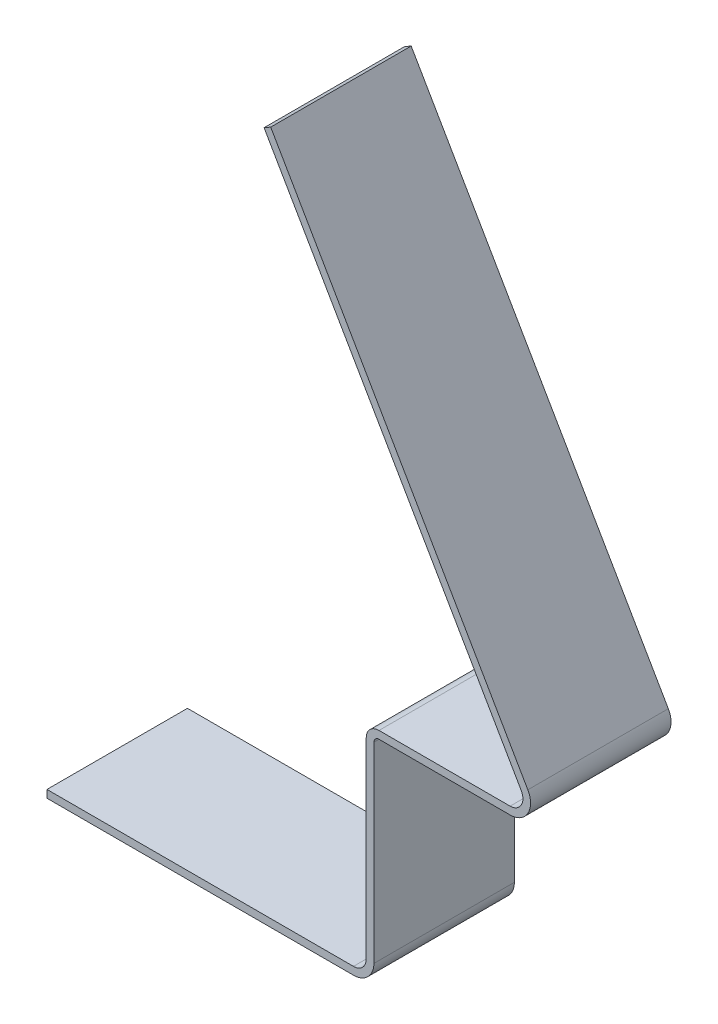
ISO-10303-21;
HEADER;
FILE_DESCRIPTION(('STEP AP214'),'2;1');
FILE_NAME('part.step','',(''),(''),'','','');
FILE_SCHEMA(('AUTOMOTIVE_DESIGN { 1 0 10303 214 1 1 1 1 }'));
ENDSEC;
DATA;
#1=APPLICATION_CONTEXT('core data for automotive mechanical design processes');
#2=APPLICATION_PROTOCOL_DEFINITION('international standard','automotive_design',2000,#1);
#3=PRODUCT_CONTEXT('',#1,'mechanical');
#4=PRODUCT('Part','Part','',(#3));
#5=PRODUCT_RELATED_PRODUCT_CATEGORY('part','',(#4));
#6=PRODUCT_DEFINITION_FORMATION('','',#4);
#7=PRODUCT_DEFINITION_CONTEXT('part definition',#1,'design');
#8=PRODUCT_DEFINITION('design','',#6,#7);
#9=PRODUCT_DEFINITION_SHAPE('','',#8);
#10=(LENGTH_UNIT() NAMED_UNIT(*) SI_UNIT(.MILLI.,.METRE.));
#11=(NAMED_UNIT(*) PLANE_ANGLE_UNIT() SI_UNIT($,.RADIAN.));
#12=(NAMED_UNIT(*) SI_UNIT($,.STERADIAN.) SOLID_ANGLE_UNIT());
#13=UNCERTAINTY_MEASURE_WITH_UNIT(LENGTH_MEASURE(1.E-05),#10,'distance_accuracy_value','');
#14=(GEOMETRIC_REPRESENTATION_CONTEXT(3) GLOBAL_UNCERTAINTY_ASSIGNED_CONTEXT((#13)) GLOBAL_UNIT_ASSIGNED_CONTEXT((#10,
#11,#12)) REPRESENTATION_CONTEXT('',''));
#15=CARTESIAN_POINT('',(0.,0.,0.));
#16=DIRECTION('',(0.,0.,1.));
#17=DIRECTION('',(1.,0.,0.));
#18=AXIS2_PLACEMENT_3D('',#15,#16,#17);
#19=CARTESIAN_POINT('',(37.6535898384862,18.8,11.));
#20=DIRECTION('',(-0.866025403784436,-0.500000000000004,0.));
#21=DIRECTION('',(0.500000000000004,-0.866025403784436,0.));
#22=AXIS2_PLACEMENT_3D('',#19,#20,#21);
#23=PLANE('',#22);
#24=DIRECTION('',(-0.500000000000004,0.866025403784436,0.));
#25=VECTOR('',#24,1.);
#26=CARTESIAN_POINT('',(37.6535898384862,18.8,0.));
#27=LINE('',#26,#25);
#28=CARTESIAN_POINT('',(37.6535898384862,18.8,0.));
#29=VERTEX_POINT('',#28);
#30=CARTESIAN_POINT('',(17.5196152422705,53.6730669589463,0.));
#31=VERTEX_POINT('',#30);
#32=EDGE_CURVE('E176',#29,#31,#27,.T.);
#33=ORIENTED_EDGE('',*,*,#32,.T.);
#34=DIRECTION('',(0.,0.,-1.));
#35=VECTOR('',#34,1.);
#36=CARTESIAN_POINT('',(17.5196152422705,53.6730669589463,11.));
#37=LINE('',#36,#35);
#38=CARTESIAN_POINT('',(17.5196152422705,53.6730669589463,11.));
#39=VERTEX_POINT('',#38);
#40=EDGE_CURVE('E11',#39,#31,#37,.T.);
#41=ORIENTED_EDGE('',*,*,#40,.F.);
#42=DIRECTION('',(-0.500000000000004,0.866025403784436,0.));
#43=VECTOR('',#42,1.);
#44=CARTESIAN_POINT('',(37.6535898384862,18.8,11.));
#45=LINE('',#44,#43);
#46=CARTESIAN_POINT('',(37.6535898384862,18.8,11.));
#47=VERTEX_POINT('',#46);
#48=EDGE_CURVE('E113',#47,#39,#45,.T.);
#49=ORIENTED_EDGE('',*,*,#48,.F.);
#50=DIRECTION('',(0.,0.,-1.));
#51=VECTOR('',#50,1.);
#52=CARTESIAN_POINT('',(37.6535898384862,18.8,11.));
#53=LINE('',#52,#51);
#54=EDGE_CURVE('E172',#47,#29,#53,.T.);
#55=ORIENTED_EDGE('',*,*,#54,.T.);
#56=EDGE_LOOP('',(#33,#41,#49,#55));
#57=FACE_BOUND('',#56,.T.);
#58=ADVANCED_FACE('F33',(#57),#23,.F.);
#59=CARTESIAN_POINT('',(16.9999999999998,53.3730669589463,11.));
#60=DIRECTION('',(-0.500000000000016,0.866025403784429,0.));
#61=DIRECTION('',(-0.866025403784429,-0.500000000000016,0.));
#62=AXIS2_PLACEMENT_3D('',#59,#60,#61);
#63=PLANE('',#62);
#64=DIRECTION('',(0.866025403784429,0.500000000000016,0.));
#65=VECTOR('',#64,1.);
#66=CARTESIAN_POINT('',(16.9999999999998,53.3730669589463,0.));
#67=LINE('',#66,#65);
#68=CARTESIAN_POINT('',(16.9999999999998,53.3730669589463,0.));
#69=VERTEX_POINT('',#68);
#70=EDGE_CURVE('E179',#69,#31,#67,.T.);
#71=ORIENTED_EDGE('',*,*,#70,.F.);
#72=DIRECTION('',(0.,0.,-1.));
#73=VECTOR('',#72,1.);
#74=CARTESIAN_POINT('',(16.9999999999998,53.3730669589463,11.));
#75=LINE('',#74,#73);
#76=CARTESIAN_POINT('',(16.9999999999998,53.3730669589463,11.));
#77=VERTEX_POINT('',#76);
#78=EDGE_CURVE('E41',#77,#69,#75,.T.);
#79=ORIENTED_EDGE('',*,*,#78,.F.);
#80=DIRECTION('',(0.866025403784429,0.500000000000016,0.));
#81=VECTOR('',#80,1.);
#82=CARTESIAN_POINT('',(16.9999999999998,53.3730669589463,11.));
#83=LINE('',#82,#81);
#84=EDGE_CURVE('E261',#77,#39,#83,.T.);
#85=ORIENTED_EDGE('',*,*,#84,.T.);
#86=ORIENTED_EDGE('',*,*,#40,.T.);
#87=EDGE_LOOP('',(#71,#79,#85,#86));
#88=FACE_BOUND('',#87,.T.);
#89=ADVANCED_FACE('F248',(#88),#63,.T.);
#90=CARTESIAN_POINT('',(37.1339745962156,18.5,11.));
#91=DIRECTION('',(-0.866025403784436,-0.500000000000004,0.));
#92=DIRECTION('',(0.500000000000004,-0.866025403784436,0.));
#93=AXIS2_PLACEMENT_3D('',#90,#91,#92);
#94=PLANE('',#93);
#95=DIRECTION('',(-0.500000000000004,0.866025403784436,0.));
#96=VECTOR('',#95,1.);
#97=CARTESIAN_POINT('',(37.1339745962156,18.5,0.));
#98=LINE('',#97,#96);
#99=CARTESIAN_POINT('',(37.1339745962156,18.5,0.));
#100=VERTEX_POINT('',#99);
#101=EDGE_CURVE('E182',#100,#69,#98,.T.);
#102=ORIENTED_EDGE('',*,*,#101,.F.);
#103=DIRECTION('',(0.,0.,-1.));
#104=VECTOR('',#103,1.);
#105=CARTESIAN_POINT('',(37.1339745962156,18.5,11.));
#106=LINE('',#105,#104);
#107=CARTESIAN_POINT('',(37.1339745962156,18.5,11.));
#108=VERTEX_POINT('',#107);
#109=EDGE_CURVE('E238',#108,#100,#106,.T.);
#110=ORIENTED_EDGE('',*,*,#109,.F.);
#111=DIRECTION('',(-0.500000000000004,0.866025403784436,0.));
#112=VECTOR('',#111,1.);
#113=CARTESIAN_POINT('',(37.1339745962156,18.5,11.));
#114=LINE('',#113,#112);
#115=EDGE_CURVE('E245',#108,#77,#114,.T.);
#116=ORIENTED_EDGE('',*,*,#115,.T.);
#117=ORIENTED_EDGE('',*,*,#78,.T.);
#118=EDGE_LOOP('',(#102,#110,#116,#117));
#119=FACE_BOUND('',#118,.T.);
#120=ADVANCED_FACE('F243',(#119),#94,.T.);
#121=CARTESIAN_POINT('',(36.2679491924311,18.,11.));
#122=DIRECTION('',(0.,0.,-1.));
#123=DIRECTION('',(-1.,0.,0.));
#124=AXIS2_PLACEMENT_3D('',#121,#122,#123);
#125=CYLINDRICAL_SURFACE('',#124,1.);
#126=CARTESIAN_POINT('',(36.2679491924311,18.,0.));
#127=DIRECTION('',(0.,0.,1.));
#128=DIRECTION('',(-1.,0.,0.));
#129=AXIS2_PLACEMENT_3D('',#126,#127,#128);
#130=CIRCLE('',#129,1.);
#131=CARTESIAN_POINT('',(36.2679491924311,17.,0.));
#132=VERTEX_POINT('',#131);
#133=EDGE_CURVE('E185',#132,#100,#130,.T.);
#134=ORIENTED_EDGE('',*,*,#133,.F.);
#135=DIRECTION('',(0.,0.,-1.));
#136=VECTOR('',#135,1.);
#137=CARTESIAN_POINT('',(36.2679491924311,17.,11.));
#138=LINE('',#137,#136);
#139=CARTESIAN_POINT('',(36.2679491924311,17.,11.));
#140=VERTEX_POINT('',#139);
#141=EDGE_CURVE('E236',#140,#132,#138,.T.);
#142=ORIENTED_EDGE('',*,*,#141,.F.);
#143=CARTESIAN_POINT('',(36.2679491924311,18.,11.));
#144=DIRECTION('',(0.,0.,1.));
#145=DIRECTION('',(-1.,0.,0.));
#146=AXIS2_PLACEMENT_3D('',#143,#144,#145);
#147=CIRCLE('',#146,1.);
#148=EDGE_CURVE('E258',#140,#108,#147,.T.);
#149=ORIENTED_EDGE('',*,*,#148,.T.);
#150=ORIENTED_EDGE('',*,*,#109,.T.);
#151=EDGE_LOOP('',(#134,#142,#149,#150));
#152=FACE_BOUND('',#151,.T.);
#153=ADVANCED_FACE('F255',(#152),#125,.F.);
#154=CARTESIAN_POINT('',(26.,17.,11.));
#155=DIRECTION('',(0.,1.,0.));
#156=DIRECTION('',(0.,0.,1.));
#157=AXIS2_PLACEMENT_3D('',#154,#155,#156);
#158=PLANE('',#157);
#159=DIRECTION('',(1.,0.,0.));
#160=VECTOR('',#159,1.);
#161=CARTESIAN_POINT('',(26.,17.,0.));
#162=LINE('',#161,#160);
#163=CARTESIAN_POINT('',(26.,17.,0.));
#164=VERTEX_POINT('',#163);
#165=EDGE_CURVE('E188',#164,#132,#162,.T.);
#166=ORIENTED_EDGE('',*,*,#165,.F.);
#167=DIRECTION('',(0.,0.,-1.));
#168=VECTOR('',#167,1.);
#169=CARTESIAN_POINT('',(26.,17.,11.));
#170=LINE('',#169,#168);
#171=CARTESIAN_POINT('',(26.,17.,11.));
#172=VERTEX_POINT('',#171);
#173=EDGE_CURVE('E234',#172,#164,#170,.T.);
#174=ORIENTED_EDGE('',*,*,#173,.F.);
#175=DIRECTION('',(1.,0.,0.));
#176=VECTOR('',#175,1.);
#177=CARTESIAN_POINT('',(26.,17.,11.));
#178=LINE('',#177,#176);
#179=EDGE_CURVE('E263',#172,#140,#178,.T.);
#180=ORIENTED_EDGE('',*,*,#179,.T.);
#181=ORIENTED_EDGE('',*,*,#141,.T.);
#182=EDGE_LOOP('',(#166,#174,#180,#181));
#183=FACE_BOUND('',#182,.T.);
#184=ADVANCED_FACE('F320',(#183),#158,.T.);
#185=CARTESIAN_POINT('',(26.,16.,11.));
#186=DIRECTION('',(0.,0.,-1.));
#187=DIRECTION('',(-1.,0.,0.));
#188=AXIS2_PLACEMENT_3D('',#185,#186,#187);
#189=CYLINDRICAL_SURFACE('',#188,1.);
#190=CARTESIAN_POINT('',(26.,16.,0.));
#191=DIRECTION('',(0.,0.,-1.));
#192=DIRECTION('',(-1.,0.,0.));
#193=AXIS2_PLACEMENT_3D('',#190,#191,#192);
#194=CIRCLE('',#193,1.);
#195=CARTESIAN_POINT('',(25.,16.,0.));
#196=VERTEX_POINT('',#195);
#197=EDGE_CURVE('E191',#196,#164,#194,.T.);
#198=ORIENTED_EDGE('',*,*,#197,.F.);
#199=DIRECTION('',(0.,0.,-1.));
#200=VECTOR('',#199,1.);
#201=CARTESIAN_POINT('',(25.,16.,11.));
#202=LINE('',#201,#200);
#203=CARTESIAN_POINT('',(25.,16.,11.));
#204=VERTEX_POINT('',#203);
#205=EDGE_CURVE('E232',#204,#196,#202,.T.);
#206=ORIENTED_EDGE('',*,*,#205,.F.);
#207=CARTESIAN_POINT('',(26.,16.,11.));
#208=DIRECTION('',(0.,0.,-1.));
#209=DIRECTION('',(-1.,0.,0.));
#210=AXIS2_PLACEMENT_3D('',#207,#208,#209);
#211=CIRCLE('',#210,1.);
#212=EDGE_CURVE('E269',#204,#172,#211,.T.);
#213=ORIENTED_EDGE('',*,*,#212,.T.);
#214=ORIENTED_EDGE('',*,*,#173,.T.);
#215=EDGE_LOOP('',(#198,#206,#213,#214));
#216=FACE_BOUND('',#215,.T.);
#217=ADVANCED_FACE('F323',(#216),#189,.T.);
#218=CARTESIAN_POINT('',(25.,1.00000000000001,11.));
#219=DIRECTION('',(-1.,0.,0.));
#220=DIRECTION('',(0.,0.,1.));
#221=AXIS2_PLACEMENT_3D('',#218,#219,#220);
#222=PLANE('',#221);
#223=DIRECTION('',(0.,1.,0.));
#224=VECTOR('',#223,1.);
#225=CARTESIAN_POINT('',(25.,1.00000000000001,0.));
#226=LINE('',#225,#224);
#227=CARTESIAN_POINT('',(25.,1.00000000000001,0.));
#228=VERTEX_POINT('',#227);
#229=EDGE_CURVE('E194',#228,#196,#226,.T.);
#230=ORIENTED_EDGE('',*,*,#229,.F.);
#231=DIRECTION('',(0.,0.,-1.));
#232=VECTOR('',#231,1.);
#233=CARTESIAN_POINT('',(25.,1.00000000000001,11.));
#234=LINE('',#233,#232);
#235=CARTESIAN_POINT('',(25.,1.00000000000001,11.));
#236=VERTEX_POINT('',#235);
#237=EDGE_CURVE('E230',#236,#228,#234,.T.);
#238=ORIENTED_EDGE('',*,*,#237,.F.);
#239=DIRECTION('',(0.,1.,0.));
#240=VECTOR('',#239,1.);
#241=CARTESIAN_POINT('',(25.,1.00000000000001,11.));
#242=LINE('',#241,#240);
#243=EDGE_CURVE('E272',#236,#204,#242,.T.);
#244=ORIENTED_EDGE('',*,*,#243,.T.);
#245=ORIENTED_EDGE('',*,*,#205,.T.);
#246=EDGE_LOOP('',(#230,#238,#244,#245));
#247=FACE_BOUND('',#246,.T.);
#248=ADVANCED_FACE('F327',(#247),#222,.T.);
#249=CARTESIAN_POINT('',(24.,1.,11.));
#250=DIRECTION('',(0.,0.,-1.));
#251=DIRECTION('',(-1.,0.,0.));
#252=AXIS2_PLACEMENT_3D('',#249,#250,#251);
#253=CYLINDRICAL_SURFACE('',#252,1.);
#254=CARTESIAN_POINT('',(24.,1.,0.));
#255=DIRECTION('',(0.,0.,1.));
#256=DIRECTION('',(-1.,0.,0.));
#257=AXIS2_PLACEMENT_3D('',#254,#255,#256);
#258=CIRCLE('',#257,1.);
#259=CARTESIAN_POINT('',(24.,0.,0.));
#260=VERTEX_POINT('',#259);
#261=EDGE_CURVE('E197',#260,#228,#258,.T.);
#262=ORIENTED_EDGE('',*,*,#261,.F.);
#263=DIRECTION('',(0.,0.,-1.));
#264=VECTOR('',#263,1.);
#265=CARTESIAN_POINT('',(24.,0.,11.));
#266=LINE('',#265,#264);
#267=CARTESIAN_POINT('',(24.,0.,11.));
#268=VERTEX_POINT('',#267);
#269=EDGE_CURVE('E228',#268,#260,#266,.T.);
#270=ORIENTED_EDGE('',*,*,#269,.F.);
#271=CARTESIAN_POINT('',(24.,1.,11.));
#272=DIRECTION('',(0.,0.,1.));
#273=DIRECTION('',(-1.,0.,0.));
#274=AXIS2_PLACEMENT_3D('',#271,#272,#273);
#275=CIRCLE('',#274,1.);
#276=EDGE_CURVE('E275',#268,#236,#275,.T.);
#277=ORIENTED_EDGE('',*,*,#276,.T.);
#278=ORIENTED_EDGE('',*,*,#237,.T.);
#279=EDGE_LOOP('',(#262,#270,#277,#278));
#280=FACE_BOUND('',#279,.T.);
#281=ADVANCED_FACE('F331',(#280),#253,.F.);
#282=CARTESIAN_POINT('',(0.,0.,11.));
#283=DIRECTION('',(0.,1.,0.));
#284=DIRECTION('',(0.,0.,1.));
#285=AXIS2_PLACEMENT_3D('',#282,#283,#284);
#286=PLANE('',#285);
#287=DIRECTION('',(1.,0.,0.));
#288=VECTOR('',#287,1.);
#289=CARTESIAN_POINT('',(0.,0.,0.));
#290=LINE('',#289,#288);
#291=CARTESIAN_POINT('',(0.,0.,0.));
#292=VERTEX_POINT('',#291);
#293=EDGE_CURVE('E200',#292,#260,#290,.T.);
#294=ORIENTED_EDGE('',*,*,#293,.F.);
#295=DIRECTION('',(0.,0.,-1.));
#296=VECTOR('',#295,1.);
#297=CARTESIAN_POINT('',(0.,0.,11.));
#298=LINE('',#297,#296);
#299=CARTESIAN_POINT('',(0.,0.,11.));
#300=VERTEX_POINT('',#299);
#301=EDGE_CURVE('E226',#300,#292,#298,.T.);
#302=ORIENTED_EDGE('',*,*,#301,.F.);
#303=DIRECTION('',(1.,0.,0.));
#304=VECTOR('',#303,1.);
#305=CARTESIAN_POINT('',(0.,0.,11.));
#306=LINE('',#305,#304);
#307=EDGE_CURVE('E278',#300,#268,#306,.T.);
#308=ORIENTED_EDGE('',*,*,#307,.T.);
#309=ORIENTED_EDGE('',*,*,#269,.T.);
#310=EDGE_LOOP('',(#294,#302,#308,#309));
#311=FACE_BOUND('',#310,.T.);
#312=ADVANCED_FACE('F335',(#311),#286,.T.);
#313=CARTESIAN_POINT('',(0.,-0.6,11.));
#314=DIRECTION('',(-1.,0.,0.));
#315=DIRECTION('',(0.,0.,1.));
#316=AXIS2_PLACEMENT_3D('',#313,#314,#315);
#317=PLANE('',#316);
#318=DIRECTION('',(0.,1.,0.));
#319=VECTOR('',#318,1.);
#320=CARTESIAN_POINT('',(0.,-0.6,0.));
#321=LINE('',#320,#319);
#322=CARTESIAN_POINT('',(0.,-0.6,0.));
#323=VERTEX_POINT('',#322);
#324=EDGE_CURVE('E203',#323,#292,#321,.T.);
#325=ORIENTED_EDGE('',*,*,#324,.F.);
#326=DIRECTION('',(0.,0.,-1.));
#327=VECTOR('',#326,1.);
#328=CARTESIAN_POINT('',(0.,-0.6,11.));
#329=LINE('',#328,#327);
#330=CARTESIAN_POINT('',(0.,-0.6,11.));
#331=VERTEX_POINT('',#330);
#332=EDGE_CURVE('E224',#331,#323,#329,.T.);
#333=ORIENTED_EDGE('',*,*,#332,.F.);
#334=DIRECTION('',(0.,1.,0.));
#335=VECTOR('',#334,1.);
#336=CARTESIAN_POINT('',(0.,-0.6,11.));
#337=LINE('',#336,#335);
#338=EDGE_CURVE('E281',#331,#300,#337,.T.);
#339=ORIENTED_EDGE('',*,*,#338,.T.);
#340=ORIENTED_EDGE('',*,*,#301,.T.);
#341=EDGE_LOOP('',(#325,#333,#339,#340));
#342=FACE_BOUND('',#341,.T.);
#343=ADVANCED_FACE('F339',(#342),#317,.T.);
#344=CARTESIAN_POINT('',(0.,-0.6,11.));
#345=DIRECTION('',(0.,1.,0.));
#346=DIRECTION('',(0.,0.,1.));
#347=AXIS2_PLACEMENT_3D('',#344,#345,#346);
#348=PLANE('',#347);
#349=DIRECTION('',(1.,0.,0.));
#350=VECTOR('',#349,1.);
#351=CARTESIAN_POINT('',(0.,-0.6,0.));
#352=LINE('',#351,#350);
#353=CARTESIAN_POINT('',(24.,-0.6,0.));
#354=VERTEX_POINT('',#353);
#355=EDGE_CURVE('E206',#323,#354,#352,.T.);
#356=ORIENTED_EDGE('',*,*,#355,.T.);
#357=DIRECTION('',(0.,0.,-1.));
#358=VECTOR('',#357,1.);
#359=CARTESIAN_POINT('',(24.,-0.6,11.));
#360=LINE('',#359,#358);
#361=CARTESIAN_POINT('',(24.,-0.6,11.));
#362=VERTEX_POINT('',#361);
#363=EDGE_CURVE('E221',#362,#354,#360,.T.);
#364=ORIENTED_EDGE('',*,*,#363,.F.);
#365=DIRECTION('',(1.,0.,0.));
#366=VECTOR('',#365,1.);
#367=CARTESIAN_POINT('',(0.,-0.6,11.));
#368=LINE('',#367,#366);
#369=EDGE_CURVE('E284',#331,#362,#368,.T.);
#370=ORIENTED_EDGE('',*,*,#369,.F.);
#371=ORIENTED_EDGE('',*,*,#332,.T.);
#372=EDGE_LOOP('',(#356,#364,#370,#371));
#373=FACE_BOUND('',#372,.T.);
#374=ADVANCED_FACE('F343',(#373),#348,.F.);
#375=CARTESIAN_POINT('',(24.,1.,11.));
#376=DIRECTION('',(0.,0.,-1.));
#377=DIRECTION('',(-1.,0.,0.));
#378=AXIS2_PLACEMENT_3D('',#375,#376,#377);
#379=CYLINDRICAL_SURFACE('',#378,1.6);
#380=CARTESIAN_POINT('',(24.,1.,0.));
#381=DIRECTION('',(0.,0.,1.));
#382=DIRECTION('',(1.,0.,0.));
#383=AXIS2_PLACEMENT_3D('',#380,#381,#382);
#384=CIRCLE('',#383,1.6);
#385=CARTESIAN_POINT('',(25.6,1.00000000000001,0.));
#386=VERTEX_POINT('',#385);
#387=EDGE_CURVE('E208',#354,#386,#384,.T.);
#388=ORIENTED_EDGE('',*,*,#387,.T.);
#389=DIRECTION('',(0.,0.,-1.));
#390=VECTOR('',#389,1.);
#391=CARTESIAN_POINT('',(25.6,1.00000000000001,11.));
#392=LINE('',#391,#390);
#393=CARTESIAN_POINT('',(25.6,1.00000000000001,11.));
#394=VERTEX_POINT('',#393);
#395=EDGE_CURVE('E218',#394,#386,#392,.T.);
#396=ORIENTED_EDGE('',*,*,#395,.F.);
#397=CARTESIAN_POINT('',(24.,1.,11.));
#398=DIRECTION('',(0.,0.,1.));
#399=DIRECTION('',(1.,0.,0.));
#400=AXIS2_PLACEMENT_3D('',#397,#398,#399);
#401=CIRCLE('',#400,1.6);
#402=EDGE_CURVE('E286',#362,#394,#401,.T.);
#403=ORIENTED_EDGE('',*,*,#402,.F.);
#404=ORIENTED_EDGE('',*,*,#363,.T.);
#405=EDGE_LOOP('',(#388,#396,#403,#404));
#406=FACE_BOUND('',#405,.T.);
#407=ADVANCED_FACE('F293',(#406),#379,.T.);
#408=CARTESIAN_POINT('',(25.6,1.00000000000001,11.));
#409=DIRECTION('',(-1.,0.,0.));
#410=DIRECTION('',(0.,0.,1.));
#411=AXIS2_PLACEMENT_3D('',#408,#409,#410);
#412=PLANE('',#411);
#413=DIRECTION('',(0.,1.,0.));
#414=VECTOR('',#413,1.);
#415=CARTESIAN_POINT('',(25.6,1.00000000000001,0.));
#416=LINE('',#415,#414);
#417=CARTESIAN_POINT('',(25.6,16.,0.));
#418=VERTEX_POINT('',#417);
#419=EDGE_CURVE('E210',#386,#418,#416,.T.);
#420=ORIENTED_EDGE('',*,*,#419,.T.);
#421=DIRECTION('',(0.,0.,-1.));
#422=VECTOR('',#421,1.);
#423=CARTESIAN_POINT('',(25.6,16.,11.));
#424=LINE('',#423,#422);
#425=CARTESIAN_POINT('',(25.6,16.,11.));
#426=VERTEX_POINT('',#425);
#427=EDGE_CURVE('E167',#426,#418,#424,.T.);
#428=ORIENTED_EDGE('',*,*,#427,.F.);
#429=DIRECTION('',(0.,1.,0.));
#430=VECTOR('',#429,1.);
#431=CARTESIAN_POINT('',(25.6,1.00000000000001,11.));
#432=LINE('',#431,#430);
#433=EDGE_CURVE('E158',#394,#426,#432,.T.);
#434=ORIENTED_EDGE('',*,*,#433,.F.);
#435=ORIENTED_EDGE('',*,*,#395,.T.);
#436=EDGE_LOOP('',(#420,#428,#434,#435));
#437=FACE_BOUND('',#436,.T.);
#438=ADVANCED_FACE('F297',(#437),#412,.F.);
#439=CARTESIAN_POINT('',(26.,16.,11.));
#440=DIRECTION('',(0.,0.,-1.));
#441=DIRECTION('',(-1.,0.,0.));
#442=AXIS2_PLACEMENT_3D('',#439,#440,#441);
#443=CYLINDRICAL_SURFACE('',#442,0.400000000000001);
#444=CARTESIAN_POINT('',(26.,16.,0.));
#445=DIRECTION('',(0.,0.,1.));
#446=DIRECTION('',(1.,0.,0.));
#447=AXIS2_PLACEMENT_3D('',#444,#445,#446);
#448=CIRCLE('',#447,0.400000000000001);
#449=CARTESIAN_POINT('',(26.,16.4,0.));
#450=VERTEX_POINT('',#449);
#451=EDGE_CURVE('E166',#418,#450,#448,.F.);
#452=ORIENTED_EDGE('',*,*,#451,.T.);
#453=DIRECTION('',(0.,0.,-1.));
#454=VECTOR('',#453,1.);
#455=CARTESIAN_POINT('',(26.,16.4,11.));
#456=LINE('',#455,#454);
#457=CARTESIAN_POINT('',(26.,16.4,11.));
#458=VERTEX_POINT('',#457);
#459=EDGE_CURVE('E163',#458,#450,#456,.T.);
#460=ORIENTED_EDGE('',*,*,#459,.F.);
#461=CARTESIAN_POINT('',(26.,16.,11.));
#462=DIRECTION('',(0.,0.,1.));
#463=DIRECTION('',(1.,0.,0.));
#464=AXIS2_PLACEMENT_3D('',#461,#462,#463);
#465=CIRCLE('',#464,0.400000000000001);
#466=EDGE_CURVE('E152',#426,#458,#465,.F.);
#467=ORIENTED_EDGE('',*,*,#466,.F.);
#468=ORIENTED_EDGE('',*,*,#427,.T.);
#469=EDGE_LOOP('',(#452,#460,#467,#468));
#470=FACE_BOUND('',#469,.T.);
#471=ADVANCED_FACE('F164',(#470),#443,.F.);
#472=CARTESIAN_POINT('',(26.,16.4,11.));
#473=DIRECTION('',(0.,1.,0.));
#474=DIRECTION('',(0.,0.,1.));
#475=AXIS2_PLACEMENT_3D('',#472,#473,#474);
#476=PLANE('',#475);
#477=DIRECTION('',(1.,0.,0.));
#478=VECTOR('',#477,1.);
#479=CARTESIAN_POINT('',(26.,16.4,0.));
#480=LINE('',#479,#478);
#481=CARTESIAN_POINT('',(36.2679491924311,16.4,0.));
#482=VERTEX_POINT('',#481);
#483=EDGE_CURVE('E101',#450,#482,#480,.T.);
#484=ORIENTED_EDGE('',*,*,#483,.T.);
#485=DIRECTION('',(0.,0.,-1.));
#486=VECTOR('',#485,1.);
#487=CARTESIAN_POINT('',(36.2679491924311,16.4,11.));
#488=LINE('',#487,#486);
#489=CARTESIAN_POINT('',(36.2679491924311,16.4,11.));
#490=VERTEX_POINT('',#489);
#491=EDGE_CURVE('E168',#490,#482,#488,.T.);
#492=ORIENTED_EDGE('',*,*,#491,.F.);
#493=DIRECTION('',(1.,0.,0.));
#494=VECTOR('',#493,1.);
#495=CARTESIAN_POINT('',(26.,16.4,11.));
#496=LINE('',#495,#494);
#497=EDGE_CURVE('E156',#458,#490,#496,.T.);
#498=ORIENTED_EDGE('',*,*,#497,.F.);
#499=ORIENTED_EDGE('',*,*,#459,.T.);
#500=EDGE_LOOP('',(#484,#492,#498,#499));
#501=FACE_BOUND('',#500,.T.);
#502=ADVANCED_FACE('F170',(#501),#476,.F.);
#503=CARTESIAN_POINT('',(36.2679491924311,18.,11.));
#504=DIRECTION('',(0.,0.,-1.));
#505=DIRECTION('',(-1.,0.,0.));
#506=AXIS2_PLACEMENT_3D('',#503,#504,#505);
#507=CYLINDRICAL_SURFACE('',#506,1.6);
#508=CARTESIAN_POINT('',(36.2679491924311,18.,0.));
#509=DIRECTION('',(0.,0.,1.));
#510=DIRECTION('',(1.,0.,0.));
#511=AXIS2_PLACEMENT_3D('',#508,#509,#510);
#512=CIRCLE('',#511,1.6);
#513=EDGE_CURVE('E107',#482,#29,#512,.T.);
#514=ORIENTED_EDGE('',*,*,#513,.T.);
#515=ORIENTED_EDGE('',*,*,#54,.F.);
#516=CARTESIAN_POINT('',(36.2679491924311,18.,11.));
#517=DIRECTION('',(0.,0.,1.));
#518=DIRECTION('',(1.,0.,0.));
#519=AXIS2_PLACEMENT_3D('',#516,#517,#518);
#520=CIRCLE('',#519,1.6);
#521=EDGE_CURVE('E49',#490,#47,#520,.T.);
#522=ORIENTED_EDGE('',*,*,#521,.F.);
#523=ORIENTED_EDGE('',*,*,#491,.T.);
#524=EDGE_LOOP('',(#514,#515,#522,#523));
#525=FACE_BOUND('',#524,.T.);
#526=ADVANCED_FACE('F299',(#525),#507,.T.);
#527=CARTESIAN_POINT('',(36.2679491924311,18.,11.));
#528=DIRECTION('',(0.,0.,1.));
#529=DIRECTION('',(1.,0.,0.));
#530=AXIS2_PLACEMENT_3D('',#527,#528,#529);
#531=PLANE('',#530);
#532=ORIENTED_EDGE('',*,*,#48,.T.);
#533=ORIENTED_EDGE('',*,*,#84,.F.);
#534=ORIENTED_EDGE('',*,*,#115,.F.);
#535=ORIENTED_EDGE('',*,*,#148,.F.);
#536=ORIENTED_EDGE('',*,*,#179,.F.);
#537=ORIENTED_EDGE('',*,*,#212,.F.);
#538=ORIENTED_EDGE('',*,*,#243,.F.);
#539=ORIENTED_EDGE('',*,*,#276,.F.);
#540=ORIENTED_EDGE('',*,*,#307,.F.);
#541=ORIENTED_EDGE('',*,*,#338,.F.);
#542=ORIENTED_EDGE('',*,*,#369,.T.);
#543=ORIENTED_EDGE('',*,*,#402,.T.);
#544=ORIENTED_EDGE('',*,*,#433,.T.);
#545=ORIENTED_EDGE('',*,*,#466,.T.);
#546=ORIENTED_EDGE('',*,*,#497,.T.);
#547=ORIENTED_EDGE('',*,*,#521,.T.);
#548=EDGE_LOOP('',(#532,#533,#534,#535,#536,#537,#538,#539,#540,#541,#542,#543,#544,#545,#546,#547));
#549=FACE_BOUND('',#548,.T.);
#550=ADVANCED_FACE('F154',(#549),#531,.T.);
#551=CARTESIAN_POINT('',(36.2679491924311,18.,0.));
#552=DIRECTION('',(0.,0.,1.));
#553=DIRECTION('',(1.,0.,0.));
#554=AXIS2_PLACEMENT_3D('',#551,#552,#553);
#555=PLANE('',#554);
#556=ORIENTED_EDGE('',*,*,#32,.F.);
#557=ORIENTED_EDGE('',*,*,#513,.F.);
#558=ORIENTED_EDGE('',*,*,#483,.F.);
#559=ORIENTED_EDGE('',*,*,#451,.F.);
#560=ORIENTED_EDGE('',*,*,#419,.F.);
#561=ORIENTED_EDGE('',*,*,#387,.F.);
#562=ORIENTED_EDGE('',*,*,#355,.F.);
#563=ORIENTED_EDGE('',*,*,#324,.T.);
#564=ORIENTED_EDGE('',*,*,#293,.T.);
#565=ORIENTED_EDGE('',*,*,#261,.T.);
#566=ORIENTED_EDGE('',*,*,#229,.T.);
#567=ORIENTED_EDGE('',*,*,#197,.T.);
#568=ORIENTED_EDGE('',*,*,#165,.T.);
#569=ORIENTED_EDGE('',*,*,#133,.T.);
#570=ORIENTED_EDGE('',*,*,#101,.T.);
#571=ORIENTED_EDGE('',*,*,#70,.T.);
#572=EDGE_LOOP('',(#556,#557,#558,#559,#560,#561,#562,#563,#564,#565,#566,#567,#568,#569,#570,#571));
#573=FACE_BOUND('',#572,.T.);
#574=ADVANCED_FACE('F251',(#573),#555,.F.);
#575=CLOSED_SHELL('',(#58,#89,#120,#153,#184,#217,#248,#281,#312,#343,#374,#407,#438,#471,#502,
#526,#550,#574));
#576=MANIFOLD_SOLID_BREP('B2',#575);
#577=ADVANCED_BREP_SHAPE_REPRESENTATION('',(#18,#576),#14);
#578=SHAPE_DEFINITION_REPRESENTATION(#9,#577);
ENDSEC;
END-ISO-10303-21;
